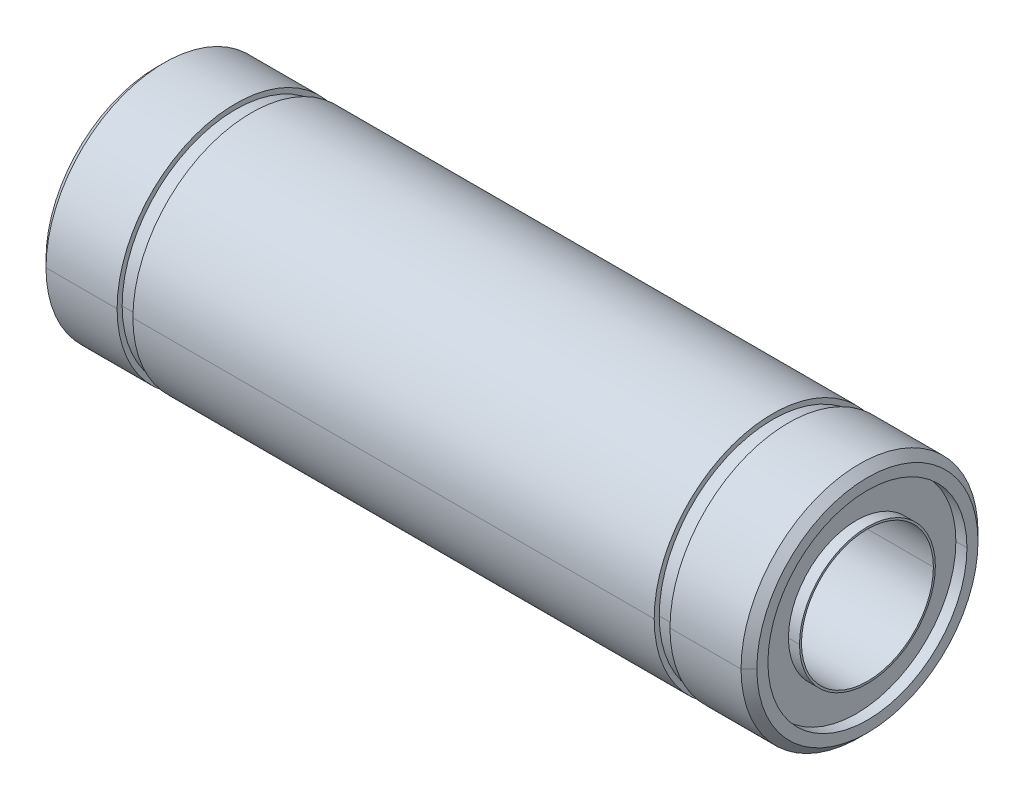
ISO-10303-21;
HEADER;
FILE_DESCRIPTION(('STEP AP214'),'2;1');
FILE_NAME('part.step','',(''),(''),'','','');
FILE_SCHEMA(('AUTOMOTIVE_DESIGN { 1 0 10303 214 1 1 1 1 }'));
ENDSEC;
DATA;
#1=APPLICATION_CONTEXT('core data for automotive mechanical design processes');
#2=APPLICATION_PROTOCOL_DEFINITION('international standard','automotive_design',2000,#1);
#3=PRODUCT_CONTEXT('',#1,'mechanical');
#4=PRODUCT('Part','Part','',(#3));
#5=PRODUCT_RELATED_PRODUCT_CATEGORY('part','',(#4));
#6=PRODUCT_DEFINITION_FORMATION('','',#4);
#7=PRODUCT_DEFINITION_CONTEXT('part definition',#1,'design');
#8=PRODUCT_DEFINITION('design','',#6,#7);
#9=PRODUCT_DEFINITION_SHAPE('','',#8);
#10=(LENGTH_UNIT() NAMED_UNIT(*) SI_UNIT(.MILLI.,.METRE.));
#11=(NAMED_UNIT(*) PLANE_ANGLE_UNIT() SI_UNIT($,.RADIAN.));
#12=(NAMED_UNIT(*) SI_UNIT($,.STERADIAN.) SOLID_ANGLE_UNIT());
#13=UNCERTAINTY_MEASURE_WITH_UNIT(LENGTH_MEASURE(1.E-05),#10,'distance_accuracy_value','');
#14=(GEOMETRIC_REPRESENTATION_CONTEXT(3) GLOBAL_UNCERTAINTY_ASSIGNED_CONTEXT((#13)) GLOBAL_UNIT_ASSIGNED_CONTEXT((#10,
#11,#12)) REPRESENTATION_CONTEXT('',''));
#15=CARTESIAN_POINT('',(0.,0.,0.));
#16=DIRECTION('',(0.,0.,1.));
#17=DIRECTION('',(1.,0.,0.));
#18=AXIS2_PLACEMENT_3D('',#15,#16,#17);
#19=CARTESIAN_POINT('',(0.,0.,0.));
#20=DIRECTION('',(1.,0.,0.));
#21=DIRECTION('',(0.,0.,-1.));
#22=AXIS2_PLACEMENT_3D('',#19,#20,#21);
#23=CONICAL_SURFACE('',#22,7.,0.785398163397443);
#24=DIRECTION('',(0.707106781186551,0.,0.707106781186544));
#25=VECTOR('',#24,1.);
#26=CARTESIAN_POINT('',(0.,0.,7.));
#27=LINE('',#26,#25);
#28=CARTESIAN_POINT('',(0.,0.,7.));
#29=VERTEX_POINT('',#28);
#30=CARTESIAN_POINT('',(0.500000000000006,0.,7.5));
#31=VERTEX_POINT('',#30);
#32=EDGE_CURVE('E225',#29,#31,#27,.T.);
#33=ORIENTED_EDGE('',*,*,#32,.F.);
#34=CARTESIAN_POINT('',(0.,0.,0.));
#35=DIRECTION('',(-1.,0.,0.));
#36=DIRECTION('',(0.,0.,-1.));
#37=AXIS2_PLACEMENT_3D('',#34,#35,#36);
#38=CIRCLE('',#37,7.);
#39=CARTESIAN_POINT('',(0.,0.,-7.));
#40=VERTEX_POINT('',#39);
#41=EDGE_CURVE('E213',#40,#29,#38,.T.);
#42=ORIENTED_EDGE('',*,*,#41,.F.);
#43=DIRECTION('',(0.707106781186551,0.,-0.707106781186544));
#44=VECTOR('',#43,1.);
#45=CARTESIAN_POINT('',(0.,0.,-7.));
#46=LINE('',#45,#44);
#47=CARTESIAN_POINT('',(0.500000000000006,0.,-7.5));
#48=VERTEX_POINT('',#47);
#49=EDGE_CURVE('E233',#40,#48,#46,.T.);
#50=ORIENTED_EDGE('',*,*,#49,.T.);
#51=CARTESIAN_POINT('',(0.500000000000006,0.,0.));
#52=DIRECTION('',(1.,0.,0.));
#53=DIRECTION('',(0.,0.,-1.));
#54=AXIS2_PLACEMENT_3D('',#51,#52,#53);
#55=CIRCLE('',#54,7.5);
#56=EDGE_CURVE('E10',#31,#48,#55,.T.);
#57=ORIENTED_EDGE('',*,*,#56,.F.);
#58=EDGE_LOOP('',(#33,#42,#50,#57));
#59=FACE_BOUND('',#58,.T.);
#60=ADVANCED_FACE('F15',(#59),#23,.T.);
#61=CARTESIAN_POINT('',(44.5,0.,0.));
#62=DIRECTION('',(-1.,0.,0.));
#63=DIRECTION('',(0.,0.,1.));
#64=AXIS2_PLACEMENT_3D('',#61,#62,#63);
#65=CONICAL_SURFACE('',#64,7.5,0.785398163397446);
#66=DIRECTION('',(-0.707106781186549,0.,-0.707106781186546));
#67=VECTOR('',#66,1.);
#68=CARTESIAN_POINT('',(44.5,0.,-7.5));
#69=LINE('',#68,#67);
#70=CARTESIAN_POINT('',(45.,0.,-7.));
#71=VERTEX_POINT('',#70);
#72=CARTESIAN_POINT('',(44.5,0.,-7.5));
#73=VERTEX_POINT('',#72);
#74=EDGE_CURVE('E242',#71,#73,#69,.T.);
#75=ORIENTED_EDGE('',*,*,#74,.F.);
#76=CARTESIAN_POINT('',(45.,0.,0.));
#77=DIRECTION('',(1.,0.,0.));
#78=DIRECTION('',(0.,0.,1.));
#79=AXIS2_PLACEMENT_3D('',#76,#77,#78);
#80=CIRCLE('',#79,7.);
#81=CARTESIAN_POINT('',(45.,0.,7.));
#82=VERTEX_POINT('',#81);
#83=EDGE_CURVE('E405',#82,#71,#80,.T.);
#84=ORIENTED_EDGE('',*,*,#83,.F.);
#85=DIRECTION('',(-0.707106781186549,0.,0.707106781186546));
#86=VECTOR('',#85,1.);
#87=CARTESIAN_POINT('',(44.5,0.,7.5));
#88=LINE('',#87,#86);
#89=CARTESIAN_POINT('',(44.5,0.,7.5));
#90=VERTEX_POINT('',#89);
#91=EDGE_CURVE('E291',#82,#90,#88,.T.);
#92=ORIENTED_EDGE('',*,*,#91,.T.);
#93=CARTESIAN_POINT('',(44.5,0.,0.));
#94=DIRECTION('',(-1.,0.,0.));
#95=DIRECTION('',(0.,0.,1.));
#96=AXIS2_PLACEMENT_3D('',#93,#94,#95);
#97=CIRCLE('',#96,7.5);
#98=EDGE_CURVE('E402',#73,#90,#97,.T.);
#99=ORIENTED_EDGE('',*,*,#98,.F.);
#100=EDGE_LOOP('',(#75,#84,#92,#99));
#101=FACE_BOUND('',#100,.T.);
#102=ADVANCED_FACE('F487',(#101),#65,.T.);
#103=CARTESIAN_POINT('',(0.,0.,0.));
#104=DIRECTION('',(-1.,0.,0.));
#105=DIRECTION('',(0.,0.,1.));
#106=AXIS2_PLACEMENT_3D('',#103,#104,#105);
#107=CYLINDRICAL_SURFACE('',#106,7.5);
#108=DIRECTION('',(-1.,0.,0.));
#109=VECTOR('',#108,1.);
#110=CARTESIAN_POINT('',(0.,0.,-7.5));
#111=LINE('',#110,#109);
#112=CARTESIAN_POINT('',(5.,0.,-7.5));
#113=VERTEX_POINT('',#112);
#114=EDGE_CURVE('E279',#113,#48,#111,.T.);
#115=ORIENTED_EDGE('',*,*,#114,.F.);
#116=CARTESIAN_POINT('',(5.,0.,0.));
#117=DIRECTION('',(-1.,0.,0.));
#118=DIRECTION('',(0.,0.,1.));
#119=AXIS2_PLACEMENT_3D('',#116,#117,#118);
#120=CIRCLE('',#119,7.5);
#121=CARTESIAN_POINT('',(5.,0.,7.5));
#122=VERTEX_POINT('',#121);
#123=EDGE_CURVE('E23',#113,#122,#120,.T.);
#124=ORIENTED_EDGE('',*,*,#123,.T.);
#125=DIRECTION('',(-1.,0.,0.));
#126=VECTOR('',#125,1.);
#127=CARTESIAN_POINT('',(0.,0.,7.5));
#128=LINE('',#127,#126);
#129=EDGE_CURVE('E276',#122,#31,#128,.T.);
#130=ORIENTED_EDGE('',*,*,#129,.T.);
#131=ORIENTED_EDGE('',*,*,#56,.T.);
#132=EDGE_LOOP('',(#115,#124,#130,#131));
#133=FACE_BOUND('',#132,.T.);
#134=ADVANCED_FACE('F469',(#133),#107,.T.);
#135=CARTESIAN_POINT('',(5.,7.5,0.));
#136=DIRECTION('',(-1.,0.,0.));
#137=DIRECTION('',(0.,0.,1.));
#138=AXIS2_PLACEMENT_3D('',#135,#136,#137);
#139=PLANE('',#138);
#140=CARTESIAN_POINT('',(5.,0.,0.));
#141=DIRECTION('',(-1.,0.,0.));
#142=DIRECTION('',(0.,0.,1.));
#143=AXIS2_PLACEMENT_3D('',#140,#141,#142);
#144=CIRCLE('',#143,7.18);
#145=CARTESIAN_POINT('',(5.,0.,7.18));
#146=VERTEX_POINT('',#145);
#147=CARTESIAN_POINT('',(5.,0.,-7.18));
#148=VERTEX_POINT('',#147);
#149=EDGE_CURVE('E274',#146,#148,#144,.T.);
#150=ORIENTED_EDGE('',*,*,#149,.T.);
#151=CARTESIAN_POINT('',(5.,0.,0.));
#152=DIRECTION('',(-1.,0.,0.));
#153=DIRECTION('',(0.,0.,1.));
#154=AXIS2_PLACEMENT_3D('',#151,#152,#153);
#155=CIRCLE('',#154,7.18);
#156=EDGE_CURVE('E337',#148,#146,#155,.T.);
#157=ORIENTED_EDGE('',*,*,#156,.T.);
#158=EDGE_LOOP('',(#150,#157));
#159=FACE_BOUND('',#158,.T.);
#160=CARTESIAN_POINT('',(5.,0.,0.));
#161=DIRECTION('',(-1.,0.,0.));
#162=DIRECTION('',(0.,0.,1.));
#163=AXIS2_PLACEMENT_3D('',#160,#161,#162);
#164=CIRCLE('',#163,7.5);
#165=EDGE_CURVE('E307',#122,#113,#164,.T.);
#166=ORIENTED_EDGE('',*,*,#165,.F.);
#167=ORIENTED_EDGE('',*,*,#123,.F.);
#168=EDGE_LOOP('',(#166,#167));
#169=FACE_BOUND('',#168,.T.);
#170=ADVANCED_FACE('F474',(#159,#169),#139,.F.);
#171=CARTESIAN_POINT('',(0.,0.,0.));
#172=DIRECTION('',(-1.,0.,0.));
#173=DIRECTION('',(0.,0.,1.));
#174=AXIS2_PLACEMENT_3D('',#171,#172,#173);
#175=CYLINDRICAL_SURFACE('',#174,7.18);
#176=DIRECTION('',(-1.,0.,0.));
#177=VECTOR('',#176,1.);
#178=CARTESIAN_POINT('',(0.,0.,-7.18));
#179=LINE('',#178,#177);
#180=CARTESIAN_POINT('',(6.,0.,-7.18));
#181=VERTEX_POINT('',#180);
#182=EDGE_CURVE('E270',#181,#148,#179,.T.);
#183=ORIENTED_EDGE('',*,*,#182,.F.);
#184=CARTESIAN_POINT('',(6.,0.,0.));
#185=DIRECTION('',(-1.,0.,0.));
#186=DIRECTION('',(0.,0.,1.));
#187=AXIS2_PLACEMENT_3D('',#184,#185,#186);
#188=CIRCLE('',#187,7.18);
#189=CARTESIAN_POINT('',(6.,0.,7.18));
#190=VERTEX_POINT('',#189);
#191=EDGE_CURVE('E340',#181,#190,#188,.T.);
#192=ORIENTED_EDGE('',*,*,#191,.T.);
#193=DIRECTION('',(-1.,0.,0.));
#194=VECTOR('',#193,1.);
#195=CARTESIAN_POINT('',(0.,0.,7.18));
#196=LINE('',#195,#194);
#197=EDGE_CURVE('E269',#190,#146,#196,.T.);
#198=ORIENTED_EDGE('',*,*,#197,.T.);
#199=ORIENTED_EDGE('',*,*,#156,.F.);
#200=EDGE_LOOP('',(#183,#192,#198,#199));
#201=FACE_BOUND('',#200,.T.);
#202=ADVANCED_FACE('F476',(#201),#175,.T.);
#203=CARTESIAN_POINT('',(6.,7.5,0.));
#204=DIRECTION('',(1.,0.,0.));
#205=DIRECTION('',(0.,1.,0.));
#206=AXIS2_PLACEMENT_3D('',#203,#204,#205);
#207=PLANE('',#206);
#208=CARTESIAN_POINT('',(6.,0.,0.));
#209=DIRECTION('',(-1.,0.,0.));
#210=DIRECTION('',(0.,0.,1.));
#211=AXIS2_PLACEMENT_3D('',#208,#209,#210);
#212=CIRCLE('',#211,7.18);
#213=EDGE_CURVE('E275',#190,#181,#212,.T.);
#214=ORIENTED_EDGE('',*,*,#213,.F.);
#215=ORIENTED_EDGE('',*,*,#191,.F.);
#216=EDGE_LOOP('',(#214,#215));
#217=FACE_BOUND('',#216,.T.);
#218=CARTESIAN_POINT('',(6.,0.,0.));
#219=DIRECTION('',(-1.,0.,0.));
#220=DIRECTION('',(0.,0.,1.));
#221=AXIS2_PLACEMENT_3D('',#218,#219,#220);
#222=CIRCLE('',#221,7.5);
#223=CARTESIAN_POINT('',(6.,0.,7.5));
#224=VERTEX_POINT('',#223);
#225=CARTESIAN_POINT('',(6.,0.,-7.5));
#226=VERTEX_POINT('',#225);
#227=EDGE_CURVE('E336',#224,#226,#222,.T.);
#228=ORIENTED_EDGE('',*,*,#227,.T.);
#229=CARTESIAN_POINT('',(6.,0.,0.));
#230=DIRECTION('',(-1.,0.,0.));
#231=DIRECTION('',(0.,0.,1.));
#232=AXIS2_PLACEMENT_3D('',#229,#230,#231);
#233=CIRCLE('',#232,7.5);
#234=EDGE_CURVE('E259',#226,#224,#233,.T.);
#235=ORIENTED_EDGE('',*,*,#234,.T.);
#236=EDGE_LOOP('',(#228,#235));
#237=FACE_BOUND('',#236,.T.);
#238=ADVANCED_FACE('F484',(#217,#237),#207,.F.);
#239=CARTESIAN_POINT('',(0.,0.,0.));
#240=DIRECTION('',(-1.,0.,0.));
#241=DIRECTION('',(0.,0.,1.));
#242=AXIS2_PLACEMENT_3D('',#239,#240,#241);
#243=CYLINDRICAL_SURFACE('',#242,7.5);
#244=DIRECTION('',(-1.,0.,0.));
#245=VECTOR('',#244,1.);
#246=CARTESIAN_POINT('',(0.,0.,-7.5));
#247=LINE('',#246,#245);
#248=CARTESIAN_POINT('',(39.,0.,-7.5));
#249=VERTEX_POINT('',#248);
#250=EDGE_CURVE('E268',#249,#226,#247,.T.);
#251=ORIENTED_EDGE('',*,*,#250,.F.);
#252=CARTESIAN_POINT('',(39.,0.,0.));
#253=DIRECTION('',(-1.,0.,0.));
#254=DIRECTION('',(0.,0.,1.));
#255=AXIS2_PLACEMENT_3D('',#252,#253,#254);
#256=CIRCLE('',#255,7.5);
#257=CARTESIAN_POINT('',(39.,0.,7.5));
#258=VERTEX_POINT('',#257);
#259=EDGE_CURVE('E256',#249,#258,#256,.T.);
#260=ORIENTED_EDGE('',*,*,#259,.T.);
#261=DIRECTION('',(-1.,0.,0.));
#262=VECTOR('',#261,1.);
#263=CARTESIAN_POINT('',(0.,0.,7.5));
#264=LINE('',#263,#262);
#265=EDGE_CURVE('E344',#258,#224,#264,.T.);
#266=ORIENTED_EDGE('',*,*,#265,.T.);
#267=ORIENTED_EDGE('',*,*,#234,.F.);
#268=EDGE_LOOP('',(#251,#260,#266,#267));
#269=FACE_BOUND('',#268,.T.);
#270=ADVANCED_FACE('F533',(#269),#243,.T.);
#271=CARTESIAN_POINT('',(39.,7.5,0.));
#272=DIRECTION('',(-1.,0.,0.));
#273=DIRECTION('',(0.,0.,1.));
#274=AXIS2_PLACEMENT_3D('',#271,#272,#273);
#275=PLANE('',#274);
#276=CARTESIAN_POINT('',(39.,0.,0.));
#277=DIRECTION('',(-1.,0.,0.));
#278=DIRECTION('',(0.,0.,1.));
#279=AXIS2_PLACEMENT_3D('',#276,#277,#278);
#280=CIRCLE('',#279,7.18);
#281=CARTESIAN_POINT('',(39.,0.,7.18));
#282=VERTEX_POINT('',#281);
#283=CARTESIAN_POINT('',(39.,0.,-7.18));
#284=VERTEX_POINT('',#283);
#285=EDGE_CURVE('E364',#282,#284,#280,.T.);
#286=ORIENTED_EDGE('',*,*,#285,.T.);
#287=CARTESIAN_POINT('',(39.,0.,0.));
#288=DIRECTION('',(-1.,0.,0.));
#289=DIRECTION('',(0.,0.,1.));
#290=AXIS2_PLACEMENT_3D('',#287,#288,#289);
#291=CIRCLE('',#290,7.18);
#292=EDGE_CURVE('E260',#284,#282,#291,.T.);
#293=ORIENTED_EDGE('',*,*,#292,.T.);
#294=EDGE_LOOP('',(#286,#293));
#295=FACE_BOUND('',#294,.T.);
#296=CARTESIAN_POINT('',(39.,0.,0.));
#297=DIRECTION('',(-1.,0.,0.));
#298=DIRECTION('',(0.,0.,1.));
#299=AXIS2_PLACEMENT_3D('',#296,#297,#298);
#300=CIRCLE('',#299,7.5);
#301=EDGE_CURVE('E264',#258,#249,#300,.T.);
#302=ORIENTED_EDGE('',*,*,#301,.F.);
#303=ORIENTED_EDGE('',*,*,#259,.F.);
#304=EDGE_LOOP('',(#302,#303));
#305=FACE_BOUND('',#304,.T.);
#306=ADVANCED_FACE('F529',(#295,#305),#275,.F.);
#307=CARTESIAN_POINT('',(0.,0.,0.));
#308=DIRECTION('',(-1.,0.,0.));
#309=DIRECTION('',(0.,0.,1.));
#310=AXIS2_PLACEMENT_3D('',#307,#308,#309);
#311=CYLINDRICAL_SURFACE('',#310,7.18);
#312=DIRECTION('',(-1.,0.,0.));
#313=VECTOR('',#312,1.);
#314=CARTESIAN_POINT('',(0.,0.,-7.18));
#315=LINE('',#314,#313);
#316=CARTESIAN_POINT('',(40.,0.,-7.18));
#317=VERTEX_POINT('',#316);
#318=EDGE_CURVE('E356',#317,#284,#315,.T.);
#319=ORIENTED_EDGE('',*,*,#318,.F.);
#320=CARTESIAN_POINT('',(40.,0.,0.));
#321=DIRECTION('',(-1.,0.,0.));
#322=DIRECTION('',(0.,0.,1.));
#323=AXIS2_PLACEMENT_3D('',#320,#321,#322);
#324=CIRCLE('',#323,7.18);
#325=CARTESIAN_POINT('',(40.,0.,7.18));
#326=VERTEX_POINT('',#325);
#327=EDGE_CURVE('E382',#317,#326,#324,.T.);
#328=ORIENTED_EDGE('',*,*,#327,.T.);
#329=DIRECTION('',(-1.,0.,0.));
#330=VECTOR('',#329,1.);
#331=CARTESIAN_POINT('',(0.,0.,7.18));
#332=LINE('',#331,#330);
#333=EDGE_CURVE('E368',#326,#282,#332,.T.);
#334=ORIENTED_EDGE('',*,*,#333,.T.);
#335=ORIENTED_EDGE('',*,*,#292,.F.);
#336=EDGE_LOOP('',(#319,#328,#334,#335));
#337=FACE_BOUND('',#336,.T.);
#338=ADVANCED_FACE('F525',(#337),#311,.T.);
#339=CARTESIAN_POINT('',(40.,7.5,0.));
#340=DIRECTION('',(1.,0.,0.));
#341=DIRECTION('',(0.,1.,0.));
#342=AXIS2_PLACEMENT_3D('',#339,#340,#341);
#343=PLANE('',#342);
#344=CARTESIAN_POINT('',(40.,0.,0.));
#345=DIRECTION('',(-1.,0.,0.));
#346=DIRECTION('',(0.,0.,1.));
#347=AXIS2_PLACEMENT_3D('',#344,#345,#346);
#348=CIRCLE('',#347,7.18);
#349=EDGE_CURVE('E348',#326,#317,#348,.T.);
#350=ORIENTED_EDGE('',*,*,#349,.F.);
#351=ORIENTED_EDGE('',*,*,#327,.F.);
#352=EDGE_LOOP('',(#350,#351));
#353=FACE_BOUND('',#352,.T.);
#354=CARTESIAN_POINT('',(40.,0.,0.));
#355=DIRECTION('',(-1.,0.,0.));
#356=DIRECTION('',(0.,0.,1.));
#357=AXIS2_PLACEMENT_3D('',#354,#355,#356);
#358=CIRCLE('',#357,7.5);
#359=CARTESIAN_POINT('',(40.,0.,7.5));
#360=VERTEX_POINT('',#359);
#361=CARTESIAN_POINT('',(40.,0.,-7.5));
#362=VERTEX_POINT('',#361);
#363=EDGE_CURVE('E308',#360,#362,#358,.T.);
#364=ORIENTED_EDGE('',*,*,#363,.T.);
#365=CARTESIAN_POINT('',(40.,0.,0.));
#366=DIRECTION('',(-1.,0.,0.));
#367=DIRECTION('',(0.,0.,1.));
#368=AXIS2_PLACEMENT_3D('',#365,#366,#367);
#369=CIRCLE('',#368,7.5);
#370=EDGE_CURVE('E385',#362,#360,#369,.T.);
#371=ORIENTED_EDGE('',*,*,#370,.T.);
#372=EDGE_LOOP('',(#364,#371));
#373=FACE_BOUND('',#372,.T.);
#374=ADVANCED_FACE('F518',(#353,#373),#343,.F.);
#375=CARTESIAN_POINT('',(0.,0.,0.));
#376=DIRECTION('',(-1.,0.,0.));
#377=DIRECTION('',(0.,0.,1.));
#378=AXIS2_PLACEMENT_3D('',#375,#376,#377);
#379=CYLINDRICAL_SURFACE('',#378,7.5);
#380=DIRECTION('',(-1.,0.,0.));
#381=VECTOR('',#380,1.);
#382=CARTESIAN_POINT('',(0.,0.,-7.5));
#383=LINE('',#382,#381);
#384=EDGE_CURVE('E312',#73,#362,#383,.T.);
#385=ORIENTED_EDGE('',*,*,#384,.F.);
#386=ORIENTED_EDGE('',*,*,#98,.T.);
#387=DIRECTION('',(-1.,0.,0.));
#388=VECTOR('',#387,1.);
#389=CARTESIAN_POINT('',(0.,0.,7.5));
#390=LINE('',#389,#388);
#391=EDGE_CURVE('E303',#90,#360,#390,.T.);
#392=ORIENTED_EDGE('',*,*,#391,.T.);
#393=ORIENTED_EDGE('',*,*,#370,.F.);
#394=EDGE_LOOP('',(#385,#386,#392,#393));
#395=FACE_BOUND('',#394,.T.);
#396=ADVANCED_FACE('F508',(#395),#379,.T.);
#397=CARTESIAN_POINT('',(45.,7.5,0.));
#398=DIRECTION('',(-1.,0.,0.));
#399=DIRECTION('',(0.,0.,1.));
#400=AXIS2_PLACEMENT_3D('',#397,#398,#399);
#401=PLANE('',#400);
#402=CARTESIAN_POINT('',(45.,0.,0.));
#403=DIRECTION('',(-1.,0.,0.));
#404=DIRECTION('',(0.,0.,1.));
#405=AXIS2_PLACEMENT_3D('',#402,#403,#404);
#406=CIRCLE('',#405,6.3);
#407=CARTESIAN_POINT('',(45.,0.,6.3));
#408=VERTEX_POINT('',#407);
#409=CARTESIAN_POINT('',(45.,0.,-6.3));
#410=VERTEX_POINT('',#409);
#411=EDGE_CURVE('E410',#408,#410,#406,.T.);
#412=ORIENTED_EDGE('',*,*,#411,.T.);
#413=CARTESIAN_POINT('',(45.,0.,0.));
#414=DIRECTION('',(-1.,0.,0.));
#415=DIRECTION('',(0.,0.,1.));
#416=AXIS2_PLACEMENT_3D('',#413,#414,#415);
#417=CIRCLE('',#416,6.3);
#418=EDGE_CURVE('E298',#410,#408,#417,.T.);
#419=ORIENTED_EDGE('',*,*,#418,.T.);
#420=EDGE_LOOP('',(#412,#419));
#421=FACE_BOUND('',#420,.T.);
#422=ORIENTED_EDGE('',*,*,#83,.T.);
#423=CARTESIAN_POINT('',(45.,0.,0.));
#424=DIRECTION('',(1.,0.,0.));
#425=DIRECTION('',(0.,0.,1.));
#426=AXIS2_PLACEMENT_3D('',#423,#424,#425);
#427=CIRCLE('',#426,7.);
#428=EDGE_CURVE('E263',#71,#82,#427,.T.);
#429=ORIENTED_EDGE('',*,*,#428,.T.);
#430=EDGE_LOOP('',(#422,#429));
#431=FACE_BOUND('',#430,.T.);
#432=ADVANCED_FACE('F505',(#421,#431),#401,.F.);
#433=CARTESIAN_POINT('',(0.,0.,0.));
#434=DIRECTION('',(-1.,0.,0.));
#435=DIRECTION('',(0.,0.,1.));
#436=AXIS2_PLACEMENT_3D('',#433,#434,#435);
#437=CYLINDRICAL_SURFACE('',#436,6.3);
#438=DIRECTION('',(-1.,0.,0.));
#439=VECTOR('',#438,1.);
#440=CARTESIAN_POINT('',(0.,0.,-6.3));
#441=LINE('',#440,#439);
#442=CARTESIAN_POINT('',(44.3,0.,-6.3));
#443=VERTEX_POINT('',#442);
#444=EDGE_CURVE('E302',#410,#443,#441,.T.);
#445=ORIENTED_EDGE('',*,*,#444,.F.);
#446=ORIENTED_EDGE('',*,*,#411,.F.);
#447=DIRECTION('',(-1.,0.,0.));
#448=VECTOR('',#447,1.);
#449=CARTESIAN_POINT('',(0.,0.,6.3));
#450=LINE('',#449,#448);
#451=CARTESIAN_POINT('',(44.3,0.,6.3));
#452=VERTEX_POINT('',#451);
#453=EDGE_CURVE('E393',#408,#452,#450,.T.);
#454=ORIENTED_EDGE('',*,*,#453,.T.);
#455=CARTESIAN_POINT('',(44.3,0.,0.));
#456=DIRECTION('',(-1.,0.,0.));
#457=DIRECTION('',(0.,0.,1.));
#458=AXIS2_PLACEMENT_3D('',#455,#456,#457);
#459=CIRCLE('',#458,6.3);
#460=EDGE_CURVE('E413',#452,#443,#459,.T.);
#461=ORIENTED_EDGE('',*,*,#460,.T.);
#462=EDGE_LOOP('',(#445,#446,#454,#461));
#463=FACE_BOUND('',#462,.T.);
#464=ADVANCED_FACE('F507',(#463),#437,.F.);
#465=CARTESIAN_POINT('',(44.3,6.3,0.));
#466=DIRECTION('',(-1.,0.,0.));
#467=DIRECTION('',(0.,0.,1.));
#468=AXIS2_PLACEMENT_3D('',#465,#466,#467);
#469=PLANE('',#468);
#470=CARTESIAN_POINT('',(44.3,0.,0.));
#471=DIRECTION('',(-1.,0.,0.));
#472=DIRECTION('',(0.,0.,1.));
#473=AXIS2_PLACEMENT_3D('',#470,#471,#472);
#474=CIRCLE('',#473,4.3);
#475=CARTESIAN_POINT('',(44.3,0.,4.3));
#476=VERTEX_POINT('',#475);
#477=CARTESIAN_POINT('',(44.3,0.,-4.3));
#478=VERTEX_POINT('',#477);
#479=EDGE_CURVE('E409',#476,#478,#474,.T.);
#480=ORIENTED_EDGE('',*,*,#479,.T.);
#481=CARTESIAN_POINT('',(44.3,0.,0.));
#482=DIRECTION('',(-1.,0.,0.));
#483=DIRECTION('',(0.,0.,1.));
#484=AXIS2_PLACEMENT_3D('',#481,#482,#483);
#485=CIRCLE('',#484,4.3);
#486=EDGE_CURVE('E244',#478,#476,#485,.T.);
#487=ORIENTED_EDGE('',*,*,#486,.T.);
#488=EDGE_LOOP('',(#480,#487));
#489=FACE_BOUND('',#488,.T.);
#490=ORIENTED_EDGE('',*,*,#460,.F.);
#491=CARTESIAN_POINT('',(44.3,0.,0.));
#492=DIRECTION('',(-1.,0.,0.));
#493=DIRECTION('',(0.,0.,1.));
#494=AXIS2_PLACEMENT_3D('',#491,#492,#493);
#495=CIRCLE('',#494,6.3);
#496=EDGE_CURVE('E389',#443,#452,#495,.T.);
#497=ORIENTED_EDGE('',*,*,#496,.F.);
#498=EDGE_LOOP('',(#490,#497));
#499=FACE_BOUND('',#498,.T.);
#500=ADVANCED_FACE('F515',(#489,#499),#469,.F.);
#501=CARTESIAN_POINT('',(0.,0.,0.));
#502=DIRECTION('',(-1.,0.,0.));
#503=DIRECTION('',(0.,0.,1.));
#504=AXIS2_PLACEMENT_3D('',#501,#502,#503);
#505=CYLINDRICAL_SURFACE('',#504,4.3);
#506=DIRECTION('',(-1.,0.,0.));
#507=VECTOR('',#506,1.);
#508=CARTESIAN_POINT('',(0.,0.,-4.3));
#509=LINE('',#508,#507);
#510=CARTESIAN_POINT('',(45.,0.,-4.3));
#511=VERTEX_POINT('',#510);
#512=EDGE_CURVE('E401',#511,#478,#509,.T.);
#513=ORIENTED_EDGE('',*,*,#512,.F.);
#514=CARTESIAN_POINT('',(45.,0.,0.));
#515=DIRECTION('',(-1.,0.,0.));
#516=DIRECTION('',(0.,0.,1.));
#517=AXIS2_PLACEMENT_3D('',#514,#515,#516);
#518=CIRCLE('',#517,4.3);
#519=CARTESIAN_POINT('',(45.,0.,4.3));
#520=VERTEX_POINT('',#519);
#521=EDGE_CURVE('E243',#511,#520,#518,.T.);
#522=ORIENTED_EDGE('',*,*,#521,.T.);
#523=DIRECTION('',(-1.,0.,0.));
#524=VECTOR('',#523,1.);
#525=CARTESIAN_POINT('',(0.,0.,4.3));
#526=LINE('',#525,#524);
#527=EDGE_CURVE('E417',#520,#476,#526,.T.);
#528=ORIENTED_EDGE('',*,*,#527,.T.);
#529=ORIENTED_EDGE('',*,*,#486,.F.);
#530=EDGE_LOOP('',(#513,#522,#528,#529));
#531=FACE_BOUND('',#530,.T.);
#532=ADVANCED_FACE('F565',(#531),#505,.T.);
#533=CARTESIAN_POINT('',(45.,4.3,0.));
#534=DIRECTION('',(-1.,0.,0.));
#535=DIRECTION('',(0.,0.,1.));
#536=AXIS2_PLACEMENT_3D('',#533,#534,#535);
#537=PLANE('',#536);
#538=CARTESIAN_POINT('',(45.,0.,0.));
#539=DIRECTION('',(-1.,0.,0.));
#540=DIRECTION('',(0.,0.,1.));
#541=AXIS2_PLACEMENT_3D('',#538,#539,#540);
#542=CIRCLE('',#541,4.175);
#543=CARTESIAN_POINT('',(45.,0.,4.175));
#544=VERTEX_POINT('',#543);
#545=CARTESIAN_POINT('',(45.,0.,-4.175));
#546=VERTEX_POINT('',#545);
#547=EDGE_CURVE('E245',#544,#546,#542,.T.);
#548=ORIENTED_EDGE('',*,*,#547,.T.);
#549=CARTESIAN_POINT('',(45.,0.,0.));
#550=DIRECTION('',(-1.,0.,0.));
#551=DIRECTION('',(0.,0.,1.));
#552=AXIS2_PLACEMENT_3D('',#549,#550,#551);
#553=CIRCLE('',#552,4.175);
#554=EDGE_CURVE('E283',#546,#544,#553,.T.);
#555=ORIENTED_EDGE('',*,*,#554,.T.);
#556=EDGE_LOOP('',(#548,#555));
#557=FACE_BOUND('',#556,.T.);
#558=CARTESIAN_POINT('',(45.,0.,0.));
#559=DIRECTION('',(-1.,0.,0.));
#560=DIRECTION('',(0.,0.,1.));
#561=AXIS2_PLACEMENT_3D('',#558,#559,#560);
#562=CIRCLE('',#561,4.3);
#563=EDGE_CURVE('E397',#520,#511,#562,.T.);
#564=ORIENTED_EDGE('',*,*,#563,.F.);
#565=ORIENTED_EDGE('',*,*,#521,.F.);
#566=EDGE_LOOP('',(#564,#565));
#567=FACE_BOUND('',#566,.T.);
#568=ADVANCED_FACE('F603',(#557,#567),#537,.F.);
#569=CARTESIAN_POINT('',(0.,0.,0.));
#570=DIRECTION('',(-1.,0.,0.));
#571=DIRECTION('',(0.,0.,1.));
#572=AXIS2_PLACEMENT_3D('',#569,#570,#571);
#573=CYLINDRICAL_SURFACE('',#572,4.175);
#574=DIRECTION('',(-1.,0.,0.));
#575=VECTOR('',#574,1.);
#576=CARTESIAN_POINT('',(0.,0.,-4.175));
#577=LINE('',#576,#575);
#578=CARTESIAN_POINT('',(0.,0.,-4.175));
#579=VERTEX_POINT('',#578);
#580=EDGE_CURVE('E252',#546,#579,#577,.T.);
#581=ORIENTED_EDGE('',*,*,#580,.F.);
#582=ORIENTED_EDGE('',*,*,#547,.F.);
#583=DIRECTION('',(-1.,0.,0.));
#584=VECTOR('',#583,1.);
#585=CARTESIAN_POINT('',(0.,0.,4.175));
#586=LINE('',#585,#584);
#587=CARTESIAN_POINT('',(0.,0.,4.175));
#588=VERTEX_POINT('',#587);
#589=EDGE_CURVE('E251',#544,#588,#586,.T.);
#590=ORIENTED_EDGE('',*,*,#589,.T.);
#591=CARTESIAN_POINT('',(0.,0.,0.));
#592=DIRECTION('',(-1.,0.,0.));
#593=DIRECTION('',(0.,0.,1.));
#594=AXIS2_PLACEMENT_3D('',#591,#592,#593);
#595=CIRCLE('',#594,4.175);
#596=EDGE_CURVE('E375',#588,#579,#595,.T.);
#597=ORIENTED_EDGE('',*,*,#596,.T.);
#598=EDGE_LOOP('',(#581,#582,#590,#597));
#599=FACE_BOUND('',#598,.T.);
#600=ADVANCED_FACE('F600',(#599),#573,.F.);
#601=CARTESIAN_POINT('',(0.,4.3,0.));
#602=DIRECTION('',(1.,0.,0.));
#603=DIRECTION('',(0.,1.,0.));
#604=AXIS2_PLACEMENT_3D('',#601,#602,#603);
#605=PLANE('',#604);
#606=ORIENTED_EDGE('',*,*,#596,.F.);
#607=CARTESIAN_POINT('',(0.,0.,0.));
#608=DIRECTION('',(-1.,0.,0.));
#609=DIRECTION('',(0.,0.,1.));
#610=AXIS2_PLACEMENT_3D('',#607,#608,#609);
#611=CIRCLE('',#610,4.175);
#612=EDGE_CURVE('E247',#579,#588,#611,.T.);
#613=ORIENTED_EDGE('',*,*,#612,.F.);
#614=EDGE_LOOP('',(#606,#613));
#615=FACE_BOUND('',#614,.T.);
#616=CARTESIAN_POINT('',(0.,0.,0.));
#617=DIRECTION('',(-1.,0.,0.));
#618=DIRECTION('',(0.,0.,1.));
#619=AXIS2_PLACEMENT_3D('',#616,#617,#618);
#620=CIRCLE('',#619,4.3);
#621=CARTESIAN_POINT('',(0.,0.,4.3));
#622=VERTEX_POINT('',#621);
#623=CARTESIAN_POINT('',(0.,0.,-4.3));
#624=VERTEX_POINT('',#623);
#625=EDGE_CURVE('E322',#622,#624,#620,.T.);
#626=ORIENTED_EDGE('',*,*,#625,.T.);
#627=CARTESIAN_POINT('',(0.,0.,0.));
#628=DIRECTION('',(-1.,0.,0.));
#629=DIRECTION('',(0.,0.,1.));
#630=AXIS2_PLACEMENT_3D('',#627,#628,#629);
#631=CIRCLE('',#630,4.3);
#632=EDGE_CURVE('E372',#624,#622,#631,.T.);
#633=ORIENTED_EDGE('',*,*,#632,.T.);
#634=EDGE_LOOP('',(#626,#633));
#635=FACE_BOUND('',#634,.T.);
#636=ADVANCED_FACE('F596',(#615,#635),#605,.F.);
#637=CARTESIAN_POINT('',(0.,0.,0.));
#638=DIRECTION('',(-1.,0.,0.));
#639=DIRECTION('',(0.,0.,1.));
#640=AXIS2_PLACEMENT_3D('',#637,#638,#639);
#641=CYLINDRICAL_SURFACE('',#640,4.3);
#642=DIRECTION('',(-1.,0.,0.));
#643=VECTOR('',#642,1.);
#644=CARTESIAN_POINT('',(0.,0.,-4.3));
#645=LINE('',#644,#643);
#646=CARTESIAN_POINT('',(0.7,0.,-4.3));
#647=VERTEX_POINT('',#646);
#648=EDGE_CURVE('E326',#647,#624,#645,.T.);
#649=ORIENTED_EDGE('',*,*,#648,.F.);
#650=CARTESIAN_POINT('',(0.7,0.,0.));
#651=DIRECTION('',(-1.,0.,0.));
#652=DIRECTION('',(0.,0.,1.));
#653=AXIS2_PLACEMENT_3D('',#650,#651,#652);
#654=CIRCLE('',#653,4.3);
#655=CARTESIAN_POINT('',(0.7,0.,4.3));
#656=VERTEX_POINT('',#655);
#657=EDGE_CURVE('E352',#647,#656,#654,.T.);
#658=ORIENTED_EDGE('',*,*,#657,.T.);
#659=DIRECTION('',(-1.,0.,0.));
#660=VECTOR('',#659,1.);
#661=CARTESIAN_POINT('',(0.,0.,4.3));
#662=LINE('',#661,#660);
#663=EDGE_CURVE('E297',#656,#622,#662,.T.);
#664=ORIENTED_EDGE('',*,*,#663,.T.);
#665=ORIENTED_EDGE('',*,*,#632,.F.);
#666=EDGE_LOOP('',(#649,#658,#664,#665));
#667=FACE_BOUND('',#666,.T.);
#668=ADVANCED_FACE('F572',(#667),#641,.T.);
#669=CARTESIAN_POINT('',(0.7,6.3,0.));
#670=DIRECTION('',(1.,0.,0.));
#671=DIRECTION('',(0.,1.,0.));
#672=AXIS2_PLACEMENT_3D('',#669,#670,#671);
#673=PLANE('',#672);
#674=CARTESIAN_POINT('',(0.7,0.,0.));
#675=DIRECTION('',(-1.,0.,0.));
#676=DIRECTION('',(0.,0.,1.));
#677=AXIS2_PLACEMENT_3D('',#674,#675,#676);
#678=CIRCLE('',#677,4.3);
#679=EDGE_CURVE('E429',#656,#647,#678,.T.);
#680=ORIENTED_EDGE('',*,*,#679,.F.);
#681=ORIENTED_EDGE('',*,*,#657,.F.);
#682=EDGE_LOOP('',(#680,#681));
#683=FACE_BOUND('',#682,.T.);
#684=CARTESIAN_POINT('',(0.7,0.,0.));
#685=DIRECTION('',(-1.,0.,0.));
#686=DIRECTION('',(0.,0.,1.));
#687=AXIS2_PLACEMENT_3D('',#684,#685,#686);
#688=CIRCLE('',#687,6.3);
#689=CARTESIAN_POINT('',(0.7,0.,6.3));
#690=VERTEX_POINT('',#689);
#691=CARTESIAN_POINT('',(0.7,0.,-6.3));
#692=VERTEX_POINT('',#691);
#693=EDGE_CURVE('E349',#690,#692,#688,.T.);
#694=ORIENTED_EDGE('',*,*,#693,.T.);
#695=CARTESIAN_POINT('',(0.7,0.,0.));
#696=DIRECTION('',(-1.,0.,0.));
#697=DIRECTION('',(0.,0.,1.));
#698=AXIS2_PLACEMENT_3D('',#695,#696,#697);
#699=CIRCLE('',#698,6.3);
#700=EDGE_CURVE('E292',#692,#690,#699,.T.);
#701=ORIENTED_EDGE('',*,*,#700,.T.);
#702=EDGE_LOOP('',(#694,#701));
#703=FACE_BOUND('',#702,.T.);
#704=ADVANCED_FACE('F569',(#683,#703),#673,.F.);
#705=CARTESIAN_POINT('',(0.,0.,0.));
#706=DIRECTION('',(-1.,0.,0.));
#707=DIRECTION('',(0.,0.,1.));
#708=AXIS2_PLACEMENT_3D('',#705,#706,#707);
#709=CYLINDRICAL_SURFACE('',#708,6.3);
#710=DIRECTION('',(-1.,0.,0.));
#711=VECTOR('',#710,1.);
#712=CARTESIAN_POINT('',(0.,0.,-6.3));
#713=LINE('',#712,#711);
#714=CARTESIAN_POINT('',(0.,0.,-6.3));
#715=VERTEX_POINT('',#714);
#716=EDGE_CURVE('E296',#692,#715,#713,.T.);
#717=ORIENTED_EDGE('',*,*,#716,.F.);
#718=ORIENTED_EDGE('',*,*,#693,.F.);
#719=DIRECTION('',(-1.,0.,0.));
#720=VECTOR('',#719,1.);
#721=CARTESIAN_POINT('',(0.,0.,6.3));
#722=LINE('',#721,#720);
#723=CARTESIAN_POINT('',(0.,0.,6.3));
#724=VERTEX_POINT('',#723);
#725=EDGE_CURVE('E222',#690,#724,#722,.T.);
#726=ORIENTED_EDGE('',*,*,#725,.T.);
#727=CARTESIAN_POINT('',(0.,0.,0.));
#728=DIRECTION('',(-1.,0.,0.));
#729=DIRECTION('',(0.,0.,1.));
#730=AXIS2_PLACEMENT_3D('',#727,#728,#729);
#731=CIRCLE('',#730,6.3);
#732=EDGE_CURVE('E35',#724,#715,#731,.T.);
#733=ORIENTED_EDGE('',*,*,#732,.T.);
#734=EDGE_LOOP('',(#717,#718,#726,#733));
#735=FACE_BOUND('',#734,.T.);
#736=ADVANCED_FACE('F571',(#735),#709,.F.);
#737=CARTESIAN_POINT('',(0.,7.5,0.));
#738=DIRECTION('',(1.,0.,0.));
#739=DIRECTION('',(0.,1.,0.));
#740=AXIS2_PLACEMENT_3D('',#737,#738,#739);
#741=PLANE('',#740);
#742=ORIENTED_EDGE('',*,*,#732,.F.);
#743=CARTESIAN_POINT('',(0.,0.,0.));
#744=DIRECTION('',(-1.,0.,0.));
#745=DIRECTION('',(0.,0.,1.));
#746=AXIS2_PLACEMENT_3D('',#743,#744,#745);
#747=CIRCLE('',#746,6.3);
#748=EDGE_CURVE('E360',#715,#724,#747,.T.);
#749=ORIENTED_EDGE('',*,*,#748,.F.);
#750=EDGE_LOOP('',(#742,#749));
#751=FACE_BOUND('',#750,.T.);
#752=ORIENTED_EDGE('',*,*,#41,.T.);
#753=CARTESIAN_POINT('',(0.,0.,0.));
#754=DIRECTION('',(-1.,0.,0.));
#755=DIRECTION('',(0.,0.,-1.));
#756=AXIS2_PLACEMENT_3D('',#753,#754,#755);
#757=CIRCLE('',#756,7.);
#758=EDGE_CURVE('E217',#29,#40,#757,.T.);
#759=ORIENTED_EDGE('',*,*,#758,.T.);
#760=EDGE_LOOP('',(#752,#759));
#761=FACE_BOUND('',#760,.T.);
#762=ADVANCED_FACE('F215',(#751,#761),#741,.F.);
#763=CARTESIAN_POINT('',(0.,0.,0.));
#764=DIRECTION('',(-1.,0.,0.));
#765=DIRECTION('',(0.,0.,1.));
#766=AXIS2_PLACEMENT_3D('',#763,#764,#765);
#767=CYLINDRICAL_SURFACE('',#766,6.3);
#768=ORIENTED_EDGE('',*,*,#700,.F.);
#769=ORIENTED_EDGE('',*,*,#716,.T.);
#770=ORIENTED_EDGE('',*,*,#748,.T.);
#771=ORIENTED_EDGE('',*,*,#725,.F.);
#772=EDGE_LOOP('',(#768,#769,#770,#771));
#773=FACE_BOUND('',#772,.T.);
#774=ADVANCED_FACE('F590',(#773),#767,.F.);
#775=CARTESIAN_POINT('',(0.,0.,0.));
#776=DIRECTION('',(-1.,0.,0.));
#777=DIRECTION('',(0.,0.,1.));
#778=AXIS2_PLACEMENT_3D('',#775,#776,#777);
#779=CYLINDRICAL_SURFACE('',#778,4.3);
#780=ORIENTED_EDGE('',*,*,#679,.T.);
#781=ORIENTED_EDGE('',*,*,#648,.T.);
#782=ORIENTED_EDGE('',*,*,#625,.F.);
#783=ORIENTED_EDGE('',*,*,#663,.F.);
#784=EDGE_LOOP('',(#780,#781,#782,#783));
#785=FACE_BOUND('',#784,.T.);
#786=ADVANCED_FACE('F586',(#785),#779,.T.);
#787=CARTESIAN_POINT('',(0.,0.,0.));
#788=DIRECTION('',(-1.,0.,0.));
#789=DIRECTION('',(0.,0.,1.));
#790=AXIS2_PLACEMENT_3D('',#787,#788,#789);
#791=CYLINDRICAL_SURFACE('',#790,4.175);
#792=ORIENTED_EDGE('',*,*,#554,.F.);
#793=ORIENTED_EDGE('',*,*,#580,.T.);
#794=ORIENTED_EDGE('',*,*,#612,.T.);
#795=ORIENTED_EDGE('',*,*,#589,.F.);
#796=EDGE_LOOP('',(#792,#793,#794,#795));
#797=FACE_BOUND('',#796,.T.);
#798=ADVANCED_FACE('F583',(#797),#791,.F.);
#799=CARTESIAN_POINT('',(0.,0.,0.));
#800=DIRECTION('',(-1.,0.,0.));
#801=DIRECTION('',(0.,0.,1.));
#802=AXIS2_PLACEMENT_3D('',#799,#800,#801);
#803=CYLINDRICAL_SURFACE('',#802,4.3);
#804=ORIENTED_EDGE('',*,*,#563,.T.);
#805=ORIENTED_EDGE('',*,*,#512,.T.);
#806=ORIENTED_EDGE('',*,*,#479,.F.);
#807=ORIENTED_EDGE('',*,*,#527,.F.);
#808=EDGE_LOOP('',(#804,#805,#806,#807));
#809=FACE_BOUND('',#808,.T.);
#810=ADVANCED_FACE('F578',(#809),#803,.T.);
#811=CARTESIAN_POINT('',(0.,0.,0.));
#812=DIRECTION('',(-1.,0.,0.));
#813=DIRECTION('',(0.,0.,1.));
#814=AXIS2_PLACEMENT_3D('',#811,#812,#813);
#815=CYLINDRICAL_SURFACE('',#814,6.3);
#816=ORIENTED_EDGE('',*,*,#418,.F.);
#817=ORIENTED_EDGE('',*,*,#444,.T.);
#818=ORIENTED_EDGE('',*,*,#496,.T.);
#819=ORIENTED_EDGE('',*,*,#453,.F.);
#820=EDGE_LOOP('',(#816,#817,#818,#819));
#821=FACE_BOUND('',#820,.T.);
#822=ADVANCED_FACE('F575',(#821),#815,.F.);
#823=CARTESIAN_POINT('',(0.,0.,0.));
#824=DIRECTION('',(-1.,0.,0.));
#825=DIRECTION('',(0.,0.,1.));
#826=AXIS2_PLACEMENT_3D('',#823,#824,#825);
#827=CYLINDRICAL_SURFACE('',#826,7.5);
#828=CARTESIAN_POINT('',(44.5,0.,0.));
#829=DIRECTION('',(-1.,0.,0.));
#830=DIRECTION('',(0.,0.,1.));
#831=AXIS2_PLACEMENT_3D('',#828,#829,#830);
#832=CIRCLE('',#831,7.5);
#833=EDGE_CURVE('E287',#90,#73,#832,.T.);
#834=ORIENTED_EDGE('',*,*,#833,.T.);
#835=ORIENTED_EDGE('',*,*,#384,.T.);
#836=ORIENTED_EDGE('',*,*,#363,.F.);
#837=ORIENTED_EDGE('',*,*,#391,.F.);
#838=EDGE_LOOP('',(#834,#835,#836,#837));
#839=FACE_BOUND('',#838,.T.);
#840=ADVANCED_FACE('F560',(#839),#827,.T.);
#841=CARTESIAN_POINT('',(0.,0.,0.));
#842=DIRECTION('',(-1.,0.,0.));
#843=DIRECTION('',(0.,0.,1.));
#844=AXIS2_PLACEMENT_3D('',#841,#842,#843);
#845=CYLINDRICAL_SURFACE('',#844,7.18);
#846=ORIENTED_EDGE('',*,*,#349,.T.);
#847=ORIENTED_EDGE('',*,*,#318,.T.);
#848=ORIENTED_EDGE('',*,*,#285,.F.);
#849=ORIENTED_EDGE('',*,*,#333,.F.);
#850=EDGE_LOOP('',(#846,#847,#848,#849));
#851=FACE_BOUND('',#850,.T.);
#852=ADVANCED_FACE('F552',(#851),#845,.T.);
#853=CARTESIAN_POINT('',(0.,0.,0.));
#854=DIRECTION('',(-1.,0.,0.));
#855=DIRECTION('',(0.,0.,1.));
#856=AXIS2_PLACEMENT_3D('',#853,#854,#855);
#857=CYLINDRICAL_SURFACE('',#856,7.5);
#858=ORIENTED_EDGE('',*,*,#301,.T.);
#859=ORIENTED_EDGE('',*,*,#250,.T.);
#860=ORIENTED_EDGE('',*,*,#227,.F.);
#861=ORIENTED_EDGE('',*,*,#265,.F.);
#862=EDGE_LOOP('',(#858,#859,#860,#861));
#863=FACE_BOUND('',#862,.T.);
#864=ADVANCED_FACE('F547',(#863),#857,.T.);
#865=CARTESIAN_POINT('',(0.,0.,0.));
#866=DIRECTION('',(-1.,0.,0.));
#867=DIRECTION('',(0.,0.,1.));
#868=AXIS2_PLACEMENT_3D('',#865,#866,#867);
#869=CYLINDRICAL_SURFACE('',#868,7.18);
#870=ORIENTED_EDGE('',*,*,#213,.T.);
#871=ORIENTED_EDGE('',*,*,#182,.T.);
#872=ORIENTED_EDGE('',*,*,#149,.F.);
#873=ORIENTED_EDGE('',*,*,#197,.F.);
#874=EDGE_LOOP('',(#870,#871,#872,#873));
#875=FACE_BOUND('',#874,.T.);
#876=ADVANCED_FACE('F551',(#875),#869,.T.);
#877=CARTESIAN_POINT('',(0.,0.,0.));
#878=DIRECTION('',(-1.,0.,0.));
#879=DIRECTION('',(0.,0.,1.));
#880=AXIS2_PLACEMENT_3D('',#877,#878,#879);
#881=CYLINDRICAL_SURFACE('',#880,7.5);
#882=ORIENTED_EDGE('',*,*,#165,.T.);
#883=ORIENTED_EDGE('',*,*,#114,.T.);
#884=CARTESIAN_POINT('',(0.500000000000006,0.,0.));
#885=DIRECTION('',(1.,0.,0.));
#886=DIRECTION('',(0.,0.,-1.));
#887=AXIS2_PLACEMENT_3D('',#884,#885,#886);
#888=CIRCLE('',#887,7.5);
#889=EDGE_CURVE('E230',#48,#31,#888,.T.);
#890=ORIENTED_EDGE('',*,*,#889,.T.);
#891=ORIENTED_EDGE('',*,*,#129,.F.);
#892=EDGE_LOOP('',(#882,#883,#890,#891));
#893=FACE_BOUND('',#892,.T.);
#894=ADVANCED_FACE('F473',(#893),#881,.T.);
#895=CARTESIAN_POINT('',(44.5,0.,0.));
#896=DIRECTION('',(-1.,0.,0.));
#897=DIRECTION('',(0.,0.,1.));
#898=AXIS2_PLACEMENT_3D('',#895,#896,#897);
#899=CONICAL_SURFACE('',#898,7.5,0.785398163397446);
#900=ORIENTED_EDGE('',*,*,#428,.F.);
#901=ORIENTED_EDGE('',*,*,#74,.T.);
#902=ORIENTED_EDGE('',*,*,#833,.F.);
#903=ORIENTED_EDGE('',*,*,#91,.F.);
#904=EDGE_LOOP('',(#900,#901,#902,#903));
#905=FACE_BOUND('',#904,.T.);
#906=ADVANCED_FACE('F503',(#905),#899,.T.);
#907=CARTESIAN_POINT('',(0.,0.,0.));
#908=DIRECTION('',(1.,0.,0.));
#909=DIRECTION('',(0.,0.,-1.));
#910=AXIS2_PLACEMENT_3D('',#907,#908,#909);
#911=CONICAL_SURFACE('',#910,7.,0.785398163397443);
#912=ORIENTED_EDGE('',*,*,#758,.F.);
#913=ORIENTED_EDGE('',*,*,#32,.T.);
#914=ORIENTED_EDGE('',*,*,#889,.F.);
#915=ORIENTED_EDGE('',*,*,#49,.F.);
#916=EDGE_LOOP('',(#912,#913,#914,#915));
#917=FACE_BOUND('',#916,.T.);
#918=ADVANCED_FACE('F232',(#917),#911,.T.);
#919=CLOSED_SHELL('',(#60,#102,#134,#170,#202,#238,#270,#306,#338,#374,#396,#432,#464,#500,#532,
#568,#600,#636,#668,#704,#736,#762,#774,#786,#798,#810,#822,#840,#852,#864,#876,#894,#906,#918));
#920=MANIFOLD_SOLID_BREP('B1',#919);
#921=ADVANCED_BREP_SHAPE_REPRESENTATION('',(#18,#920),#14);
#922=SHAPE_DEFINITION_REPRESENTATION(#9,#921);
ENDSEC;
END-ISO-10303-21;
